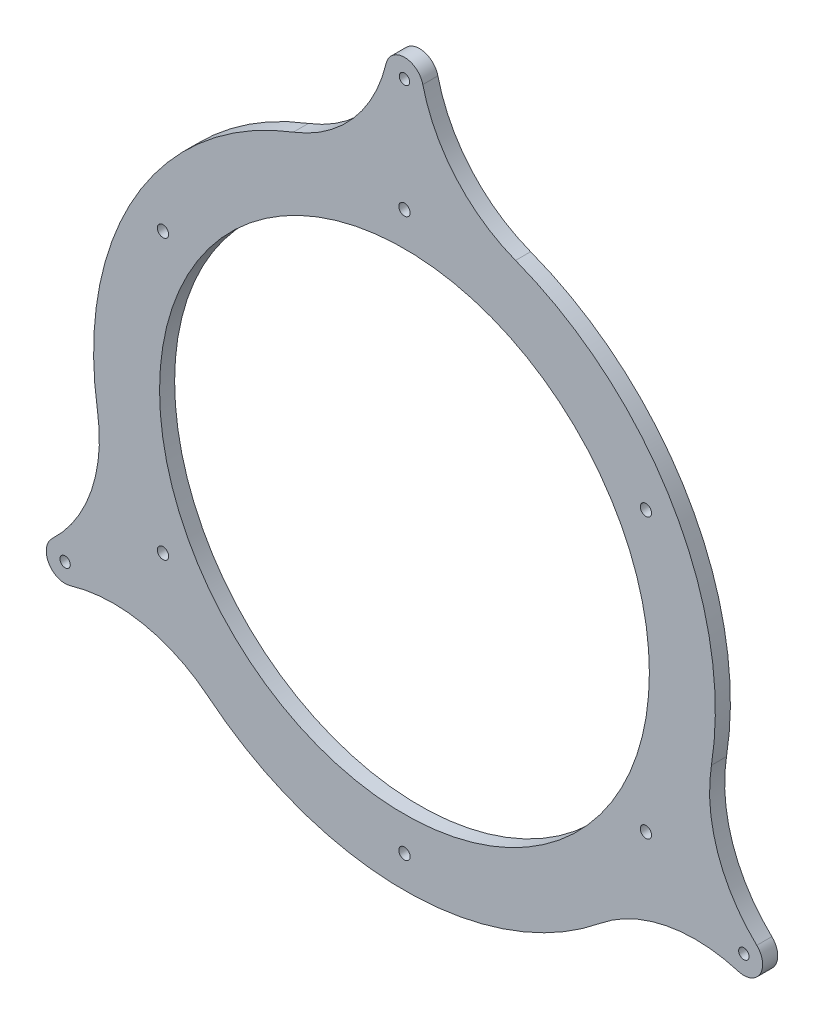
ISO-10303-21;
HEADER;
FILE_DESCRIPTION(('STEP AP214'),'2;1');
FILE_NAME('part.step','',(''),(''),'','','');
FILE_SCHEMA(('AUTOMOTIVE_DESIGN { 1 0 10303 214 1 1 1 1 }'));
ENDSEC;
DATA;
#1=APPLICATION_CONTEXT('core data for automotive mechanical design processes');
#2=APPLICATION_PROTOCOL_DEFINITION('international standard','automotive_design',2000,#1);
#3=PRODUCT_CONTEXT('',#1,'mechanical');
#4=PRODUCT('Part','Part','',(#3));
#5=PRODUCT_RELATED_PRODUCT_CATEGORY('part','',(#4));
#6=PRODUCT_DEFINITION_FORMATION('','',#4);
#7=PRODUCT_DEFINITION_CONTEXT('part definition',#1,'design');
#8=PRODUCT_DEFINITION('design','',#6,#7);
#9=PRODUCT_DEFINITION_SHAPE('','',#8);
#10=(LENGTH_UNIT() NAMED_UNIT(*) SI_UNIT(.MILLI.,.METRE.));
#11=(NAMED_UNIT(*) PLANE_ANGLE_UNIT() SI_UNIT($,.RADIAN.));
#12=(NAMED_UNIT(*) SI_UNIT($,.STERADIAN.) SOLID_ANGLE_UNIT());
#13=UNCERTAINTY_MEASURE_WITH_UNIT(LENGTH_MEASURE(1.E-05),#10,'distance_accuracy_value','');
#14=(GEOMETRIC_REPRESENTATION_CONTEXT(3) GLOBAL_UNCERTAINTY_ASSIGNED_CONTEXT((#13)) GLOBAL_UNIT_ASSIGNED_CONTEXT((#10,
#11,#12)) REPRESENTATION_CONTEXT('',''));
#15=CARTESIAN_POINT('',(0.,0.,0.));
#16=DIRECTION('',(0.,0.,1.));
#17=DIRECTION('',(1.,0.,0.));
#18=AXIS2_PLACEMENT_3D('',#15,#16,#17);
#19=CARTESIAN_POINT('',(21.8896945094251,57.2049278846154,4.));
#20=DIRECTION('',(0.,0.,1.));
#21=DIRECTION('',(1.,0.,0.));
#22=AXIS2_PLACEMENT_3D('',#19,#20,#21);
#23=PLANE('',#22);
#24=CARTESIAN_POINT('',(64.0858798800485,37.,4.));
#25=DIRECTION('',(0.,0.,1.));
#26=DIRECTION('',(1.,0.,0.));
#27=AXIS2_PLACEMENT_3D('',#24,#25,#26);
#28=CIRCLE('',#27,1.5);
#29=CARTESIAN_POINT('',(65.5858798800485,37.,4.));
#30=VERTEX_POINT('',#29);
#31=EDGE_CURVE('E313',#30,#30,#28,.T.);
#32=ORIENTED_EDGE('',*,*,#31,.F.);
#33=EDGE_LOOP('',(#32));
#34=FACE_BOUND('',#33,.T.);
#35=CARTESIAN_POINT('',(0.,-74.,4.));
#36=DIRECTION('',(0.,0.,1.));
#37=DIRECTION('',(1.,0.,0.));
#38=AXIS2_PLACEMENT_3D('',#35,#36,#37);
#39=CIRCLE('',#38,1.5);
#40=CARTESIAN_POINT('',(1.5,-74.,4.));
#41=VERTEX_POINT('',#40);
#42=EDGE_CURVE('E310',#41,#41,#39,.T.);
#43=ORIENTED_EDGE('',*,*,#42,.F.);
#44=EDGE_LOOP('',(#43));
#45=FACE_BOUND('',#44,.T.);
#46=CARTESIAN_POINT('',(0.,0.,4.));
#47=DIRECTION('',(0.,0.,1.));
#48=DIRECTION('',(1.,0.,0.));
#49=AXIS2_PLACEMENT_3D('',#46,#47,#48);
#50=CIRCLE('',#49,65.);
#51=CARTESIAN_POINT('',(65.,0.,4.));
#52=VERTEX_POINT('',#51);
#53=EDGE_CURVE('E316',#52,#52,#50,.T.);
#54=ORIENTED_EDGE('',*,*,#53,.F.);
#55=EDGE_LOOP('',(#54));
#56=FACE_BOUND('',#55,.T.);
#57=CARTESIAN_POINT('',(-64.0858798800484,-37.,4.));
#58=DIRECTION('',(0.,0.,1.));
#59=DIRECTION('',(1.,0.,0.));
#60=AXIS2_PLACEMENT_3D('',#57,#58,#59);
#61=CIRCLE('',#60,1.5);
#62=CARTESIAN_POINT('',(-62.5858798800484,-37.,4.));
#63=VERTEX_POINT('',#62);
#64=EDGE_CURVE('E330',#63,#63,#61,.T.);
#65=ORIENTED_EDGE('',*,*,#64,.F.);
#66=EDGE_LOOP('',(#65));
#67=FACE_BOUND('',#66,.T.);
#68=CARTESIAN_POINT('',(64.0858798800485,-37.,4.));
#69=DIRECTION('',(0.,0.,1.));
#70=DIRECTION('',(1.,0.,0.));
#71=AXIS2_PLACEMENT_3D('',#68,#69,#70);
#72=CIRCLE('',#71,1.5);
#73=CARTESIAN_POINT('',(65.5858798800485,-37.,4.));
#74=VERTEX_POINT('',#73);
#75=EDGE_CURVE('E331',#74,#74,#72,.T.);
#76=ORIENTED_EDGE('',*,*,#75,.F.);
#77=EDGE_LOOP('',(#76));
#78=FACE_BOUND('',#77,.T.);
#79=CARTESIAN_POINT('',(-64.0858798800484,37.,4.));
#80=DIRECTION('',(0.,0.,1.));
#81=DIRECTION('',(1.,0.,0.));
#82=AXIS2_PLACEMENT_3D('',#79,#80,#81);
#83=CIRCLE('',#82,1.5);
#84=CARTESIAN_POINT('',(-62.5858798800484,37.,4.));
#85=VERTEX_POINT('',#84);
#86=EDGE_CURVE('E324',#85,#85,#83,.T.);
#87=ORIENTED_EDGE('',*,*,#86,.F.);
#88=EDGE_LOOP('',(#87));
#89=FACE_BOUND('',#88,.T.);
#90=CARTESIAN_POINT('',(0.,74.,4.));
#91=DIRECTION('',(0.,0.,1.));
#92=DIRECTION('',(1.,0.,0.));
#93=AXIS2_PLACEMENT_3D('',#90,#91,#92);
#94=CIRCLE('',#93,1.5);
#95=CARTESIAN_POINT('',(1.5,74.,4.));
#96=VERTEX_POINT('',#95);
#97=EDGE_CURVE('E342',#96,#96,#94,.T.);
#98=ORIENTED_EDGE('',*,*,#97,.F.);
#99=EDGE_LOOP('',(#98));
#100=FACE_BOUND('',#99,.T.);
#101=CARTESIAN_POINT('',(90.0666419935817,-52.,4.));
#102=DIRECTION('',(0.,0.,1.));
#103=DIRECTION('',(1.,0.,0.));
#104=AXIS2_PLACEMENT_3D('',#101,#102,#103);
#105=CIRCLE('',#104,1.375);
#106=CARTESIAN_POINT('',(91.4416419935817,-52.,4.));
#107=VERTEX_POINT('',#106);
#108=EDGE_CURVE('E357',#107,#107,#105,.T.);
#109=ORIENTED_EDGE('',*,*,#108,.F.);
#110=EDGE_LOOP('',(#109));
#111=FACE_BOUND('',#110,.T.);
#112=CARTESIAN_POINT('',(43.7793890188501,114.409855769231,4.));
#113=DIRECTION('',(0.,0.,-1.));
#114=DIRECTION('',(1.,0.,0.));
#115=AXIS2_PLACEMENT_3D('',#112,#113,#114);
#116=CIRCLE('',#115,40.);
#117=CARTESIAN_POINT('',(29.4840783188174,77.0515355180534,4.));
#118=VERTEX_POINT('',#117);
#119=CARTESIAN_POINT('',(4.86437655765001,105.156650641026,4.));
#120=VERTEX_POINT('',#119);
#121=EDGE_CURVE('E177',#118,#120,#116,.T.);
#122=ORIENTED_EDGE('',*,*,#121,.T.);
#123=CARTESIAN_POINT('',(0.,104.,4.));
#124=DIRECTION('',(0.,0.,1.));
#125=DIRECTION('',(1.,0.,0.));
#126=AXIS2_PLACEMENT_3D('',#123,#124,#125);
#127=CIRCLE('',#126,5.);
#128=CARTESIAN_POINT('',(-4.86437655765001,105.156650641026,4.));
#129=VERTEX_POINT('',#128);
#130=EDGE_CURVE('E105',#120,#129,#127,.T.);
#131=ORIENTED_EDGE('',*,*,#130,.T.);
#132=CARTESIAN_POINT('',(-43.7793890188501,114.409855769231,4.));
#133=DIRECTION('',(0.,0.,-1.));
#134=DIRECTION('',(-1.,0.,0.));
#135=AXIS2_PLACEMENT_3D('',#132,#133,#134);
#136=CIRCLE('',#135,40.);
#137=CARTESIAN_POINT('',(-29.4840783188174,77.0515355180534,4.));
#138=VERTEX_POINT('',#137);
#139=EDGE_CURVE('E204',#129,#138,#136,.T.);
#140=ORIENTED_EDGE('',*,*,#139,.T.);
#141=CARTESIAN_POINT('',(0.,0.,4.));
#142=DIRECTION('',(0.,0.,1.));
#143=DIRECTION('',(1.,0.,0.));
#144=AXIS2_PLACEMENT_3D('',#141,#142,#143);
#145=CIRCLE('',#144,82.5);
#146=CARTESIAN_POINT('',(-81.4706263186419,-12.9918069277609,4.));
#147=VERTEX_POINT('',#146);
#148=EDGE_CURVE('E223',#138,#147,#145,.T.);
#149=ORIENTED_EDGE('',*,*,#148,.T.);
#150=CARTESIAN_POINT('',(-120.971536048893,-19.2908648321298,4.));
#151=DIRECTION('',(0.,0.,-1.));
#152=DIRECTION('',(1.,0.,0.));
#153=AXIS2_PLACEMENT_3D('',#150,#151,#152);
#154=CIRCLE('',#153,40.);
#155=CARTESIAN_POINT('',(-93.5005191108384,-48.3656516480145,4.));
#156=VERTEX_POINT('',#155);
#157=EDGE_CURVE('E220',#147,#156,#154,.T.);
#158=ORIENTED_EDGE('',*,*,#157,.T.);
#159=CARTESIAN_POINT('',(-90.0666419935816,-52.,4.));
#160=DIRECTION('',(0.,0.,1.));
#161=DIRECTION('',(1.,0.,0.));
#162=AXIS2_PLACEMENT_3D('',#159,#160,#161);
#163=CIRCLE('',#162,5.);
#164=CARTESIAN_POINT('',(-88.6361425531883,-56.7909989930113,4.));
#165=VERTEX_POINT('',#164);
#166=EDGE_CURVE('E222',#156,#165,#163,.T.);
#167=ORIENTED_EDGE('',*,*,#166,.T.);
#168=CARTESIAN_POINT('',(-77.1921470300424,-95.1189909371011,4.));
#169=DIRECTION('',(0.,0.,-1.));
#170=DIRECTION('',(-1.,0.,0.));
#171=AXIS2_PLACEMENT_3D('',#168,#169,#170);
#172=CIRCLE('',#171,40.);
#173=CARTESIAN_POINT('',(-51.9865479998245,-64.0597285902926,4.));
#174=VERTEX_POINT('',#173);
#175=EDGE_CURVE('E225',#165,#174,#172,.T.);
#176=ORIENTED_EDGE('',*,*,#175,.T.);
#177=CARTESIAN_POINT('',(0.,0.,4.));
#178=DIRECTION('',(0.,0.,1.));
#179=DIRECTION('',(1.,0.,0.));
#180=AXIS2_PLACEMENT_3D('',#177,#178,#179);
#181=CIRCLE('',#180,82.5);
#182=CARTESIAN_POINT('',(51.9865479998245,-64.0597285902926,4.));
#183=VERTEX_POINT('',#182);
#184=EDGE_CURVE('E231',#174,#183,#181,.T.);
#185=ORIENTED_EDGE('',*,*,#184,.T.);
#186=CARTESIAN_POINT('',(77.1921470300425,-95.118990937101,4.));
#187=DIRECTION('',(0.,0.,-1.));
#188=DIRECTION('',(1.,0.,0.));
#189=AXIS2_PLACEMENT_3D('',#186,#187,#188);
#190=CIRCLE('',#189,40.);
#191=CARTESIAN_POINT('',(88.6361425531884,-56.7909989930112,4.));
#192=VERTEX_POINT('',#191);
#193=EDGE_CURVE('E136',#183,#192,#190,.T.);
#194=ORIENTED_EDGE('',*,*,#193,.T.);
#195=CARTESIAN_POINT('',(90.0666419935817,-52.,4.));
#196=DIRECTION('',(0.,0.,1.));
#197=DIRECTION('',(1.,0.,0.));
#198=AXIS2_PLACEMENT_3D('',#195,#196,#197);
#199=CIRCLE('',#198,5.);
#200=CARTESIAN_POINT('',(93.5005191108384,-48.3656516480144,4.));
#201=VERTEX_POINT('',#200);
#202=EDGE_CURVE('E130',#192,#201,#199,.T.);
#203=ORIENTED_EDGE('',*,*,#202,.T.);
#204=CARTESIAN_POINT('',(120.971536048893,-19.2908648321297,4.));
#205=DIRECTION('',(0.,0.,-1.));
#206=DIRECTION('',(-1.,0.,0.));
#207=AXIS2_PLACEMENT_3D('',#204,#205,#206);
#208=CIRCLE('',#207,40.);
#209=CARTESIAN_POINT('',(81.4706263186419,-12.9918069277608,4.));
#210=VERTEX_POINT('',#209);
#211=EDGE_CURVE('E134',#201,#210,#208,.T.);
#212=ORIENTED_EDGE('',*,*,#211,.T.);
#213=CARTESIAN_POINT('',(0.,0.,4.));
#214=DIRECTION('',(0.,0.,1.));
#215=DIRECTION('',(1.,0.,0.));
#216=AXIS2_PLACEMENT_3D('',#213,#214,#215);
#217=CIRCLE('',#216,82.5);
#218=EDGE_CURVE('E50',#210,#118,#217,.T.);
#219=ORIENTED_EDGE('',*,*,#218,.T.);
#220=EDGE_LOOP('',(#122,#131,#140,#149,#158,#167,#176,#185,#194,#203,#212,#219));
#221=FACE_BOUND('',#220,.T.);
#222=CARTESIAN_POINT('',(0.,104.,4.));
#223=DIRECTION('',(0.,0.,1.));
#224=DIRECTION('',(1.,0.,0.));
#225=AXIS2_PLACEMENT_3D('',#222,#223,#224);
#226=CIRCLE('',#225,1.375);
#227=CARTESIAN_POINT('',(1.375,104.,4.));
#228=VERTEX_POINT('',#227);
#229=EDGE_CURVE('E158',#228,#228,#226,.T.);
#230=ORIENTED_EDGE('',*,*,#229,.F.);
#231=EDGE_LOOP('',(#230));
#232=FACE_BOUND('',#231,.T.);
#233=CARTESIAN_POINT('',(-90.0666419935816,-52.,4.));
#234=DIRECTION('',(0.,0.,1.));
#235=DIRECTION('',(1.,0.,0.));
#236=AXIS2_PLACEMENT_3D('',#233,#234,#235);
#237=CIRCLE('',#236,1.375);
#238=CARTESIAN_POINT('',(-88.6916419935816,-52.,4.));
#239=VERTEX_POINT('',#238);
#240=EDGE_CURVE('E351',#239,#239,#237,.T.);
#241=ORIENTED_EDGE('',*,*,#240,.F.);
#242=EDGE_LOOP('',(#241));
#243=FACE_BOUND('',#242,.T.);
#244=ADVANCED_FACE('F33',(#34,#45,#56,#67,#78,#89,#100,#111,#221,#232,#243),#23,.T.);
#245=CARTESIAN_POINT('',(21.8896945094251,57.2049278846154,0.));
#246=DIRECTION('',(0.,0.,1.));
#247=DIRECTION('',(1.,0.,0.));
#248=AXIS2_PLACEMENT_3D('',#245,#246,#247);
#249=PLANE('',#248);
#250=CARTESIAN_POINT('',(64.0858798800485,37.,0.));
#251=DIRECTION('',(0.,0.,1.));
#252=DIRECTION('',(1.,0.,0.));
#253=AXIS2_PLACEMENT_3D('',#250,#251,#252);
#254=CIRCLE('',#253,1.5);
#255=CARTESIAN_POINT('',(65.5858798800485,37.,0.));
#256=VERTEX_POINT('',#255);
#257=EDGE_CURVE('E321',#256,#256,#254,.T.);
#258=ORIENTED_EDGE('',*,*,#257,.T.);
#259=EDGE_LOOP('',(#258));
#260=FACE_BOUND('',#259,.T.);
#261=CARTESIAN_POINT('',(0.,-74.,0.));
#262=DIRECTION('',(0.,0.,1.));
#263=DIRECTION('',(1.,0.,0.));
#264=AXIS2_PLACEMENT_3D('',#261,#262,#263);
#265=CIRCLE('',#264,1.5);
#266=CARTESIAN_POINT('',(1.5,-74.,0.));
#267=VERTEX_POINT('',#266);
#268=EDGE_CURVE('E307',#267,#267,#265,.T.);
#269=ORIENTED_EDGE('',*,*,#268,.T.);
#270=EDGE_LOOP('',(#269));
#271=FACE_BOUND('',#270,.T.);
#272=CARTESIAN_POINT('',(0.,0.,0.));
#273=DIRECTION('',(0.,0.,1.));
#274=DIRECTION('',(1.,0.,0.));
#275=AXIS2_PLACEMENT_3D('',#272,#273,#274);
#276=CIRCLE('',#275,65.);
#277=CARTESIAN_POINT('',(65.,0.,0.));
#278=VERTEX_POINT('',#277);
#279=EDGE_CURVE('E311',#278,#278,#276,.T.);
#280=ORIENTED_EDGE('',*,*,#279,.T.);
#281=EDGE_LOOP('',(#280));
#282=FACE_BOUND('',#281,.T.);
#283=CARTESIAN_POINT('',(-64.0858798800484,-37.,0.));
#284=DIRECTION('',(0.,0.,1.));
#285=DIRECTION('',(1.,0.,0.));
#286=AXIS2_PLACEMENT_3D('',#283,#284,#285);
#287=CIRCLE('',#286,1.5);
#288=CARTESIAN_POINT('',(-62.5858798800484,-37.,0.));
#289=VERTEX_POINT('',#288);
#290=EDGE_CURVE('E339',#289,#289,#287,.T.);
#291=ORIENTED_EDGE('',*,*,#290,.T.);
#292=EDGE_LOOP('',(#291));
#293=FACE_BOUND('',#292,.T.);
#294=CARTESIAN_POINT('',(64.0858798800485,-37.,0.));
#295=DIRECTION('',(0.,0.,1.));
#296=DIRECTION('',(1.,0.,0.));
#297=AXIS2_PLACEMENT_3D('',#294,#295,#296);
#298=CIRCLE('',#297,1.5);
#299=CARTESIAN_POINT('',(65.5858798800485,-37.,0.));
#300=VERTEX_POINT('',#299);
#301=EDGE_CURVE('E327',#300,#300,#298,.T.);
#302=ORIENTED_EDGE('',*,*,#301,.T.);
#303=EDGE_LOOP('',(#302));
#304=FACE_BOUND('',#303,.T.);
#305=CARTESIAN_POINT('',(-64.0858798800484,37.,0.));
#306=DIRECTION('',(0.,0.,1.));
#307=DIRECTION('',(1.,0.,0.));
#308=AXIS2_PLACEMENT_3D('',#305,#306,#307);
#309=CIRCLE('',#308,1.5);
#310=CARTESIAN_POINT('',(-62.5858798800484,37.,0.));
#311=VERTEX_POINT('',#310);
#312=EDGE_CURVE('E334',#311,#311,#309,.T.);
#313=ORIENTED_EDGE('',*,*,#312,.T.);
#314=EDGE_LOOP('',(#313));
#315=FACE_BOUND('',#314,.T.);
#316=CARTESIAN_POINT('',(0.,74.,0.));
#317=DIRECTION('',(0.,0.,1.));
#318=DIRECTION('',(1.,0.,0.));
#319=AXIS2_PLACEMENT_3D('',#316,#317,#318);
#320=CIRCLE('',#319,1.5);
#321=CARTESIAN_POINT('',(1.5,74.,0.));
#322=VERTEX_POINT('',#321);
#323=EDGE_CURVE('E345',#322,#322,#320,.T.);
#324=ORIENTED_EDGE('',*,*,#323,.T.);
#325=EDGE_LOOP('',(#324));
#326=FACE_BOUND('',#325,.T.);
#327=CARTESIAN_POINT('',(43.7793890188501,114.409855769231,0.));
#328=DIRECTION('',(0.,0.,-1.));
#329=DIRECTION('',(1.,0.,0.));
#330=AXIS2_PLACEMENT_3D('',#327,#328,#329);
#331=CIRCLE('',#330,40.);
#332=CARTESIAN_POINT('',(29.4840783188174,77.0515355180534,0.));
#333=VERTEX_POINT('',#332);
#334=CARTESIAN_POINT('',(4.86437655765001,105.156650641026,0.));
#335=VERTEX_POINT('',#334);
#336=EDGE_CURVE('E154',#333,#335,#331,.T.);
#337=ORIENTED_EDGE('',*,*,#336,.F.);
#338=CARTESIAN_POINT('',(0.,0.,0.));
#339=DIRECTION('',(0.,0.,1.));
#340=DIRECTION('',(1.,0.,0.));
#341=AXIS2_PLACEMENT_3D('',#338,#339,#340);
#342=CIRCLE('',#341,82.5);
#343=CARTESIAN_POINT('',(81.4706263186419,-12.9918069277608,0.));
#344=VERTEX_POINT('',#343);
#345=EDGE_CURVE('E97',#344,#333,#342,.T.);
#346=ORIENTED_EDGE('',*,*,#345,.F.);
#347=CARTESIAN_POINT('',(120.971536048893,-19.2908648321297,0.));
#348=DIRECTION('',(0.,0.,-1.));
#349=DIRECTION('',(-1.,0.,0.));
#350=AXIS2_PLACEMENT_3D('',#347,#348,#349);
#351=CIRCLE('',#350,40.);
#352=CARTESIAN_POINT('',(93.5005191108384,-48.3656516480144,0.));
#353=VERTEX_POINT('',#352);
#354=EDGE_CURVE('E91',#353,#344,#351,.T.);
#355=ORIENTED_EDGE('',*,*,#354,.F.);
#356=CARTESIAN_POINT('',(90.0666419935817,-52.,0.));
#357=DIRECTION('',(0.,0.,1.));
#358=DIRECTION('',(1.,0.,0.));
#359=AXIS2_PLACEMENT_3D('',#356,#357,#358);
#360=CIRCLE('',#359,5.);
#361=CARTESIAN_POINT('',(88.6361425531884,-56.7909989930112,0.));
#362=VERTEX_POINT('',#361);
#363=EDGE_CURVE('E144',#362,#353,#360,.T.);
#364=ORIENTED_EDGE('',*,*,#363,.F.);
#365=CARTESIAN_POINT('',(77.1921470300425,-95.118990937101,0.));
#366=DIRECTION('',(0.,0.,-1.));
#367=DIRECTION('',(1.,0.,0.));
#368=AXIS2_PLACEMENT_3D('',#365,#366,#367);
#369=CIRCLE('',#368,40.);
#370=CARTESIAN_POINT('',(51.9865479998245,-64.0597285902926,0.));
#371=VERTEX_POINT('',#370);
#372=EDGE_CURVE('E172',#371,#362,#369,.T.);
#373=ORIENTED_EDGE('',*,*,#372,.F.);
#374=CARTESIAN_POINT('',(0.,0.,0.));
#375=DIRECTION('',(0.,0.,1.));
#376=DIRECTION('',(1.,0.,0.));
#377=AXIS2_PLACEMENT_3D('',#374,#375,#376);
#378=CIRCLE('',#377,82.5);
#379=CARTESIAN_POINT('',(-51.9865479998245,-64.0597285902926,0.));
#380=VERTEX_POINT('',#379);
#381=EDGE_CURVE('E170',#380,#371,#378,.T.);
#382=ORIENTED_EDGE('',*,*,#381,.F.);
#383=CARTESIAN_POINT('',(-77.1921470300424,-95.1189909371011,0.));
#384=DIRECTION('',(0.,0.,-1.));
#385=DIRECTION('',(-1.,0.,0.));
#386=AXIS2_PLACEMENT_3D('',#383,#384,#385);
#387=CIRCLE('',#386,40.);
#388=CARTESIAN_POINT('',(-88.6361425531883,-56.7909989930113,0.));
#389=VERTEX_POINT('',#388);
#390=EDGE_CURVE('E168',#389,#380,#387,.T.);
#391=ORIENTED_EDGE('',*,*,#390,.F.);
#392=CARTESIAN_POINT('',(-90.0666419935816,-52.,0.));
#393=DIRECTION('',(0.,0.,1.));
#394=DIRECTION('',(1.,0.,0.));
#395=AXIS2_PLACEMENT_3D('',#392,#393,#394);
#396=CIRCLE('',#395,5.);
#397=CARTESIAN_POINT('',(-93.5005191108384,-48.3656516480145,0.));
#398=VERTEX_POINT('',#397);
#399=EDGE_CURVE('E166',#398,#389,#396,.T.);
#400=ORIENTED_EDGE('',*,*,#399,.F.);
#401=CARTESIAN_POINT('',(-120.971536048893,-19.2908648321298,0.));
#402=DIRECTION('',(0.,0.,-1.));
#403=DIRECTION('',(1.,0.,0.));
#404=AXIS2_PLACEMENT_3D('',#401,#402,#403);
#405=CIRCLE('',#404,40.);
#406=CARTESIAN_POINT('',(-81.4706263186419,-12.9918069277609,0.));
#407=VERTEX_POINT('',#406);
#408=EDGE_CURVE('E164',#407,#398,#405,.T.);
#409=ORIENTED_EDGE('',*,*,#408,.F.);
#410=CARTESIAN_POINT('',(0.,0.,0.));
#411=DIRECTION('',(0.,0.,1.));
#412=DIRECTION('',(1.,0.,0.));
#413=AXIS2_PLACEMENT_3D('',#410,#411,#412);
#414=CIRCLE('',#413,82.5);
#415=CARTESIAN_POINT('',(-29.4840783188174,77.0515355180534,0.));
#416=VERTEX_POINT('',#415);
#417=EDGE_CURVE('E162',#416,#407,#414,.T.);
#418=ORIENTED_EDGE('',*,*,#417,.F.);
#419=CARTESIAN_POINT('',(-43.7793890188501,114.409855769231,0.));
#420=DIRECTION('',(0.,0.,-1.));
#421=DIRECTION('',(-1.,0.,0.));
#422=AXIS2_PLACEMENT_3D('',#419,#420,#421);
#423=CIRCLE('',#422,40.);
#424=CARTESIAN_POINT('',(-4.86437655765001,105.156650641026,0.));
#425=VERTEX_POINT('',#424);
#426=EDGE_CURVE('E160',#425,#416,#423,.T.);
#427=ORIENTED_EDGE('',*,*,#426,.F.);
#428=CARTESIAN_POINT('',(0.,104.,0.));
#429=DIRECTION('',(0.,0.,1.));
#430=DIRECTION('',(1.,0.,0.));
#431=AXIS2_PLACEMENT_3D('',#428,#429,#430);
#432=CIRCLE('',#431,5.);
#433=EDGE_CURVE('E157',#335,#425,#432,.T.);
#434=ORIENTED_EDGE('',*,*,#433,.F.);
#435=EDGE_LOOP('',(#337,#346,#355,#364,#373,#382,#391,#400,#409,#418,#427,#434));
#436=FACE_BOUND('',#435,.T.);
#437=CARTESIAN_POINT('',(0.,104.,0.));
#438=DIRECTION('',(0.,0.,1.));
#439=DIRECTION('',(1.,0.,0.));
#440=AXIS2_PLACEMENT_3D('',#437,#438,#439);
#441=CIRCLE('',#440,1.375);
#442=CARTESIAN_POINT('',(1.375,104.,0.));
#443=VERTEX_POINT('',#442);
#444=EDGE_CURVE('E360',#443,#443,#441,.T.);
#445=ORIENTED_EDGE('',*,*,#444,.T.);
#446=EDGE_LOOP('',(#445));
#447=FACE_BOUND('',#446,.T.);
#448=CARTESIAN_POINT('',(90.0666419935817,-52.,0.));
#449=DIRECTION('',(0.,0.,1.));
#450=DIRECTION('',(1.,0.,0.));
#451=AXIS2_PLACEMENT_3D('',#448,#449,#450);
#452=CIRCLE('',#451,1.375);
#453=CARTESIAN_POINT('',(91.4416419935817,-52.,0.));
#454=VERTEX_POINT('',#453);
#455=EDGE_CURVE('E354',#454,#454,#452,.T.);
#456=ORIENTED_EDGE('',*,*,#455,.T.);
#457=EDGE_LOOP('',(#456));
#458=FACE_BOUND('',#457,.T.);
#459=CARTESIAN_POINT('',(-90.0666419935816,-52.,0.));
#460=DIRECTION('',(0.,0.,1.));
#461=DIRECTION('',(1.,0.,0.));
#462=AXIS2_PLACEMENT_3D('',#459,#460,#461);
#463=CIRCLE('',#462,1.375);
#464=CARTESIAN_POINT('',(-88.6916419935816,-52.,0.));
#465=VERTEX_POINT('',#464);
#466=EDGE_CURVE('E348',#465,#465,#463,.T.);
#467=ORIENTED_EDGE('',*,*,#466,.T.);
#468=EDGE_LOOP('',(#467));
#469=FACE_BOUND('',#468,.T.);
#470=ADVANCED_FACE('F208',(#260,#271,#282,#293,#304,#315,#326,#436,#447,#458,#469),#249,.F.);
#471=CARTESIAN_POINT('',(43.7793890188501,114.409855769231,4.));
#472=DIRECTION('',(0.,0.,-1.));
#473=DIRECTION('',(-1.,0.,0.));
#474=AXIS2_PLACEMENT_3D('',#471,#472,#473);
#475=CYLINDRICAL_SURFACE('',#474,40.);
#476=ORIENTED_EDGE('',*,*,#336,.T.);
#477=DIRECTION('',(0.,0.,-1.));
#478=VECTOR('',#477,1.);
#479=CARTESIAN_POINT('',(4.86437655765001,105.156650641026,4.));
#480=LINE('',#479,#478);
#481=EDGE_CURVE('E11',#120,#335,#480,.T.);
#482=ORIENTED_EDGE('',*,*,#481,.F.);
#483=ORIENTED_EDGE('',*,*,#121,.F.);
#484=DIRECTION('',(0.,0.,-1.));
#485=VECTOR('',#484,1.);
#486=CARTESIAN_POINT('',(29.4840783188174,77.0515355180534,4.));
#487=LINE('',#486,#485);
#488=EDGE_CURVE('E150',#118,#333,#487,.T.);
#489=ORIENTED_EDGE('',*,*,#488,.T.);
#490=EDGE_LOOP('',(#476,#482,#483,#489));
#491=FACE_BOUND('',#490,.T.);
#492=ADVANCED_FACE('F35',(#491),#475,.F.);
#493=CARTESIAN_POINT('',(0.,104.,4.));
#494=DIRECTION('',(0.,0.,-1.));
#495=DIRECTION('',(-1.,0.,0.));
#496=AXIS2_PLACEMENT_3D('',#493,#494,#495);
#497=CYLINDRICAL_SURFACE('',#496,5.);
#498=ORIENTED_EDGE('',*,*,#433,.T.);
#499=DIRECTION('',(0.,0.,-1.));
#500=VECTOR('',#499,1.);
#501=CARTESIAN_POINT('',(-4.86437655765001,105.156650641026,4.));
#502=LINE('',#501,#500);
#503=EDGE_CURVE('E42',#129,#425,#502,.T.);
#504=ORIENTED_EDGE('',*,*,#503,.F.);
#505=ORIENTED_EDGE('',*,*,#130,.F.);
#506=ORIENTED_EDGE('',*,*,#481,.T.);
#507=EDGE_LOOP('',(#498,#504,#505,#506));
#508=FACE_BOUND('',#507,.T.);
#509=ADVANCED_FACE('F529',(#508),#497,.T.);
#510=CARTESIAN_POINT('',(-43.7793890188501,114.409855769231,4.));
#511=DIRECTION('',(0.,0.,-1.));
#512=DIRECTION('',(-1.,0.,0.));
#513=AXIS2_PLACEMENT_3D('',#510,#511,#512);
#514=CYLINDRICAL_SURFACE('',#513,40.);
#515=ORIENTED_EDGE('',*,*,#426,.T.);
#516=DIRECTION('',(0.,0.,-1.));
#517=VECTOR('',#516,1.);
#518=CARTESIAN_POINT('',(-29.4840783188174,77.0515355180534,4.));
#519=LINE('',#518,#517);
#520=EDGE_CURVE('E196',#138,#416,#519,.T.);
#521=ORIENTED_EDGE('',*,*,#520,.F.);
#522=ORIENTED_EDGE('',*,*,#139,.F.);
#523=ORIENTED_EDGE('',*,*,#503,.T.);
#524=EDGE_LOOP('',(#515,#521,#522,#523));
#525=FACE_BOUND('',#524,.T.);
#526=ADVANCED_FACE('F202',(#525),#514,.F.);
#527=CARTESIAN_POINT('',(0.,0.,4.));
#528=DIRECTION('',(0.,0.,-1.));
#529=DIRECTION('',(-1.,0.,0.));
#530=AXIS2_PLACEMENT_3D('',#527,#528,#529);
#531=CYLINDRICAL_SURFACE('',#530,82.5);
#532=ORIENTED_EDGE('',*,*,#417,.T.);
#533=DIRECTION('',(0.,0.,-1.));
#534=VECTOR('',#533,1.);
#535=CARTESIAN_POINT('',(-81.4706263186419,-12.9918069277609,4.));
#536=LINE('',#535,#534);
#537=EDGE_CURVE('E193',#147,#407,#536,.T.);
#538=ORIENTED_EDGE('',*,*,#537,.F.);
#539=ORIENTED_EDGE('',*,*,#148,.F.);
#540=ORIENTED_EDGE('',*,*,#520,.T.);
#541=EDGE_LOOP('',(#532,#538,#539,#540));
#542=FACE_BOUND('',#541,.T.);
#543=ADVANCED_FACE('F214',(#542),#531,.T.);
#544=CARTESIAN_POINT('',(-120.971536048893,-19.2908648321298,4.));
#545=DIRECTION('',(0.,0.,-1.));
#546=DIRECTION('',(-1.,0.,0.));
#547=AXIS2_PLACEMENT_3D('',#544,#545,#546);
#548=CYLINDRICAL_SURFACE('',#547,40.);
#549=ORIENTED_EDGE('',*,*,#408,.T.);
#550=DIRECTION('',(0.,0.,-1.));
#551=VECTOR('',#550,1.);
#552=CARTESIAN_POINT('',(-93.5005191108384,-48.3656516480145,4.));
#553=LINE('',#552,#551);
#554=EDGE_CURVE('E190',#156,#398,#553,.T.);
#555=ORIENTED_EDGE('',*,*,#554,.F.);
#556=ORIENTED_EDGE('',*,*,#157,.F.);
#557=ORIENTED_EDGE('',*,*,#537,.T.);
#558=EDGE_LOOP('',(#549,#555,#556,#557));
#559=FACE_BOUND('',#558,.T.);
#560=ADVANCED_FACE('F218',(#559),#548,.F.);
#561=CARTESIAN_POINT('',(-90.0666419935816,-52.,4.));
#562=DIRECTION('',(0.,0.,-1.));
#563=DIRECTION('',(-1.,0.,0.));
#564=AXIS2_PLACEMENT_3D('',#561,#562,#563);
#565=CYLINDRICAL_SURFACE('',#564,5.);
#566=ORIENTED_EDGE('',*,*,#399,.T.);
#567=DIRECTION('',(0.,0.,-1.));
#568=VECTOR('',#567,1.);
#569=CARTESIAN_POINT('',(-88.6361425531883,-56.7909989930113,4.));
#570=LINE('',#569,#568);
#571=EDGE_CURVE('E187',#165,#389,#570,.T.);
#572=ORIENTED_EDGE('',*,*,#571,.F.);
#573=ORIENTED_EDGE('',*,*,#166,.F.);
#574=ORIENTED_EDGE('',*,*,#554,.T.);
#575=EDGE_LOOP('',(#566,#572,#573,#574));
#576=FACE_BOUND('',#575,.T.);
#577=ADVANCED_FACE('F498',(#576),#565,.T.);
#578=CARTESIAN_POINT('',(-77.1921470300424,-95.1189909371011,4.));
#579=DIRECTION('',(0.,0.,-1.));
#580=DIRECTION('',(-1.,0.,0.));
#581=AXIS2_PLACEMENT_3D('',#578,#579,#580);
#582=CYLINDRICAL_SURFACE('',#581,40.);
#583=ORIENTED_EDGE('',*,*,#390,.T.);
#584=DIRECTION('',(0.,0.,-1.));
#585=VECTOR('',#584,1.);
#586=CARTESIAN_POINT('',(-51.9865479998245,-64.0597285902926,4.));
#587=LINE('',#586,#585);
#588=EDGE_CURVE('E184',#174,#380,#587,.T.);
#589=ORIENTED_EDGE('',*,*,#588,.F.);
#590=ORIENTED_EDGE('',*,*,#175,.F.);
#591=ORIENTED_EDGE('',*,*,#571,.T.);
#592=EDGE_LOOP('',(#583,#589,#590,#591));
#593=FACE_BOUND('',#592,.T.);
#594=ADVANCED_FACE('F490',(#593),#582,.F.);
#595=CARTESIAN_POINT('',(0.,0.,4.));
#596=DIRECTION('',(0.,0.,-1.));
#597=DIRECTION('',(-1.,0.,0.));
#598=AXIS2_PLACEMENT_3D('',#595,#596,#597);
#599=CYLINDRICAL_SURFACE('',#598,82.5);
#600=ORIENTED_EDGE('',*,*,#381,.T.);
#601=DIRECTION('',(0.,0.,-1.));
#602=VECTOR('',#601,1.);
#603=CARTESIAN_POINT('',(51.9865479998245,-64.0597285902926,4.));
#604=LINE('',#603,#602);
#605=EDGE_CURVE('E181',#183,#371,#604,.T.);
#606=ORIENTED_EDGE('',*,*,#605,.F.);
#607=ORIENTED_EDGE('',*,*,#184,.F.);
#608=ORIENTED_EDGE('',*,*,#588,.T.);
#609=EDGE_LOOP('',(#600,#606,#607,#608));
#610=FACE_BOUND('',#609,.T.);
#611=ADVANCED_FACE('F237',(#610),#599,.T.);
#612=CARTESIAN_POINT('',(77.1921470300425,-95.118990937101,4.));
#613=DIRECTION('',(0.,0.,-1.));
#614=DIRECTION('',(-1.,0.,0.));
#615=AXIS2_PLACEMENT_3D('',#612,#613,#614);
#616=CYLINDRICAL_SURFACE('',#615,40.);
#617=ORIENTED_EDGE('',*,*,#372,.T.);
#618=DIRECTION('',(0.,0.,-1.));
#619=VECTOR('',#618,1.);
#620=CARTESIAN_POINT('',(88.6361425531884,-56.7909989930112,4.));
#621=LINE('',#620,#619);
#622=EDGE_CURVE('E145',#192,#362,#621,.T.);
#623=ORIENTED_EDGE('',*,*,#622,.F.);
#624=ORIENTED_EDGE('',*,*,#193,.F.);
#625=ORIENTED_EDGE('',*,*,#605,.T.);
#626=EDGE_LOOP('',(#617,#623,#624,#625));
#627=FACE_BOUND('',#626,.T.);
#628=ADVANCED_FACE('F241',(#627),#616,.F.);
#629=CARTESIAN_POINT('',(90.0666419935817,-52.,4.));
#630=DIRECTION('',(0.,0.,-1.));
#631=DIRECTION('',(-1.,0.,0.));
#632=AXIS2_PLACEMENT_3D('',#629,#630,#631);
#633=CYLINDRICAL_SURFACE('',#632,5.);
#634=ORIENTED_EDGE('',*,*,#363,.T.);
#635=DIRECTION('',(0.,0.,-1.));
#636=VECTOR('',#635,1.);
#637=CARTESIAN_POINT('',(93.5005191108384,-48.3656516480144,4.));
#638=LINE('',#637,#636);
#639=EDGE_CURVE('E141',#201,#353,#638,.T.);
#640=ORIENTED_EDGE('',*,*,#639,.F.);
#641=ORIENTED_EDGE('',*,*,#202,.F.);
#642=ORIENTED_EDGE('',*,*,#622,.T.);
#643=EDGE_LOOP('',(#634,#640,#641,#642));
#644=FACE_BOUND('',#643,.T.);
#645=ADVANCED_FACE('F142',(#644),#633,.T.);
#646=CARTESIAN_POINT('',(120.971536048893,-19.2908648321297,4.));
#647=DIRECTION('',(0.,0.,-1.));
#648=DIRECTION('',(-1.,0.,0.));
#649=AXIS2_PLACEMENT_3D('',#646,#647,#648);
#650=CYLINDRICAL_SURFACE('',#649,40.);
#651=ORIENTED_EDGE('',*,*,#354,.T.);
#652=DIRECTION('',(0.,0.,-1.));
#653=VECTOR('',#652,1.);
#654=CARTESIAN_POINT('',(81.4706263186419,-12.9918069277608,4.));
#655=LINE('',#654,#653);
#656=EDGE_CURVE('E146',#210,#344,#655,.T.);
#657=ORIENTED_EDGE('',*,*,#656,.F.);
#658=ORIENTED_EDGE('',*,*,#211,.F.);
#659=ORIENTED_EDGE('',*,*,#639,.T.);
#660=EDGE_LOOP('',(#651,#657,#658,#659));
#661=FACE_BOUND('',#660,.T.);
#662=ADVANCED_FACE('F148',(#661),#650,.F.);
#663=CARTESIAN_POINT('',(0.,0.,4.));
#664=DIRECTION('',(0.,0.,-1.));
#665=DIRECTION('',(-1.,0.,0.));
#666=AXIS2_PLACEMENT_3D('',#663,#664,#665);
#667=CYLINDRICAL_SURFACE('',#666,82.5);
#668=ORIENTED_EDGE('',*,*,#345,.T.);
#669=ORIENTED_EDGE('',*,*,#488,.F.);
#670=ORIENTED_EDGE('',*,*,#218,.F.);
#671=ORIENTED_EDGE('',*,*,#656,.T.);
#672=EDGE_LOOP('',(#668,#669,#670,#671));
#673=FACE_BOUND('',#672,.T.);
#674=ADVANCED_FACE('F245',(#673),#667,.T.);
#675=CARTESIAN_POINT('',(0.,104.,4.));
#676=DIRECTION('',(0.,0.,-1.));
#677=DIRECTION('',(-1.,0.,0.));
#678=AXIS2_PLACEMENT_3D('',#675,#676,#677);
#679=CYLINDRICAL_SURFACE('',#678,1.375);
#680=ORIENTED_EDGE('',*,*,#229,.T.);
#681=EDGE_LOOP('',(#680));
#682=FACE_BOUND('',#681,.T.);
#683=ORIENTED_EDGE('',*,*,#444,.F.);
#684=EDGE_LOOP('',(#683));
#685=FACE_BOUND('',#684,.T.);
#686=ADVANCED_FACE('F247',(#682,#685),#679,.F.);
#687=CARTESIAN_POINT('',(90.0666419935817,-52.,4.));
#688=DIRECTION('',(0.,0.,-1.));
#689=DIRECTION('',(-1.,0.,0.));
#690=AXIS2_PLACEMENT_3D('',#687,#688,#689);
#691=CYLINDRICAL_SURFACE('',#690,1.375);
#692=ORIENTED_EDGE('',*,*,#108,.T.);
#693=EDGE_LOOP('',(#692));
#694=FACE_BOUND('',#693,.T.);
#695=ORIENTED_EDGE('',*,*,#455,.F.);
#696=EDGE_LOOP('',(#695));
#697=FACE_BOUND('',#696,.T.);
#698=ADVANCED_FACE('F253',(#694,#697),#691,.F.);
#699=CARTESIAN_POINT('',(-90.0666419935816,-52.,4.));
#700=DIRECTION('',(0.,0.,-1.));
#701=DIRECTION('',(-1.,0.,0.));
#702=AXIS2_PLACEMENT_3D('',#699,#700,#701);
#703=CYLINDRICAL_SURFACE('',#702,1.375);
#704=ORIENTED_EDGE('',*,*,#240,.T.);
#705=EDGE_LOOP('',(#704));
#706=FACE_BOUND('',#705,.T.);
#707=ORIENTED_EDGE('',*,*,#466,.F.);
#708=EDGE_LOOP('',(#707));
#709=FACE_BOUND('',#708,.T.);
#710=ADVANCED_FACE('F270',(#706,#709),#703,.F.);
#711=CARTESIAN_POINT('',(0.,74.,0.));
#712=DIRECTION('',(0.,0.,1.));
#713=DIRECTION('',(1.,0.,0.));
#714=AXIS2_PLACEMENT_3D('',#711,#712,#713);
#715=CYLINDRICAL_SURFACE('',#714,1.5);
#716=ORIENTED_EDGE('',*,*,#323,.F.);
#717=EDGE_LOOP('',(#716));
#718=FACE_BOUND('',#717,.T.);
#719=ORIENTED_EDGE('',*,*,#97,.T.);
#720=EDGE_LOOP('',(#719));
#721=FACE_BOUND('',#720,.T.);
#722=ADVANCED_FACE('F274',(#718,#721),#715,.F.);
#723=CARTESIAN_POINT('',(-64.0858798800484,37.,0.));
#724=DIRECTION('',(0.,0.,1.));
#725=DIRECTION('',(1.,0.,0.));
#726=AXIS2_PLACEMENT_3D('',#723,#724,#725);
#727=CYLINDRICAL_SURFACE('',#726,1.5);
#728=ORIENTED_EDGE('',*,*,#312,.F.);
#729=EDGE_LOOP('',(#728));
#730=FACE_BOUND('',#729,.T.);
#731=ORIENTED_EDGE('',*,*,#86,.T.);
#732=EDGE_LOOP('',(#731));
#733=FACE_BOUND('',#732,.T.);
#734=ADVANCED_FACE('F278',(#730,#733),#727,.F.);
#735=CARTESIAN_POINT('',(64.0858798800485,-37.,0.));
#736=DIRECTION('',(0.,0.,1.));
#737=DIRECTION('',(1.,0.,0.));
#738=AXIS2_PLACEMENT_3D('',#735,#736,#737);
#739=CYLINDRICAL_SURFACE('',#738,1.5);
#740=ORIENTED_EDGE('',*,*,#301,.F.);
#741=EDGE_LOOP('',(#740));
#742=FACE_BOUND('',#741,.T.);
#743=ORIENTED_EDGE('',*,*,#75,.T.);
#744=EDGE_LOOP('',(#743));
#745=FACE_BOUND('',#744,.T.);
#746=ADVANCED_FACE('F284',(#742,#745),#739,.F.);
#747=CARTESIAN_POINT('',(-64.0858798800484,-37.,0.));
#748=DIRECTION('',(0.,0.,1.));
#749=DIRECTION('',(1.,0.,0.));
#750=AXIS2_PLACEMENT_3D('',#747,#748,#749);
#751=CYLINDRICAL_SURFACE('',#750,1.5);
#752=ORIENTED_EDGE('',*,*,#290,.F.);
#753=EDGE_LOOP('',(#752));
#754=FACE_BOUND('',#753,.T.);
#755=ORIENTED_EDGE('',*,*,#64,.T.);
#756=EDGE_LOOP('',(#755));
#757=FACE_BOUND('',#756,.T.);
#758=ADVANCED_FACE('F280',(#754,#757),#751,.F.);
#759=CARTESIAN_POINT('',(0.,0.,0.));
#760=DIRECTION('',(0.,0.,1.));
#761=DIRECTION('',(1.,0.,0.));
#762=AXIS2_PLACEMENT_3D('',#759,#760,#761);
#763=CYLINDRICAL_SURFACE('',#762,65.);
#764=ORIENTED_EDGE('',*,*,#279,.F.);
#765=EDGE_LOOP('',(#764));
#766=FACE_BOUND('',#765,.T.);
#767=ORIENTED_EDGE('',*,*,#53,.T.);
#768=EDGE_LOOP('',(#767));
#769=FACE_BOUND('',#768,.T.);
#770=ADVANCED_FACE('F283',(#766,#769),#763,.F.);
#771=CARTESIAN_POINT('',(0.,-74.,0.));
#772=DIRECTION('',(0.,0.,1.));
#773=DIRECTION('',(1.,0.,0.));
#774=AXIS2_PLACEMENT_3D('',#771,#772,#773);
#775=CYLINDRICAL_SURFACE('',#774,1.5);
#776=ORIENTED_EDGE('',*,*,#268,.F.);
#777=EDGE_LOOP('',(#776));
#778=FACE_BOUND('',#777,.T.);
#779=ORIENTED_EDGE('',*,*,#42,.T.);
#780=EDGE_LOOP('',(#779));
#781=FACE_BOUND('',#780,.T.);
#782=ADVANCED_FACE('F295',(#778,#781),#775,.F.);
#783=CARTESIAN_POINT('',(64.0858798800485,37.,0.));
#784=DIRECTION('',(0.,0.,1.));
#785=DIRECTION('',(1.,0.,0.));
#786=AXIS2_PLACEMENT_3D('',#783,#784,#785);
#787=CYLINDRICAL_SURFACE('',#786,1.5);
#788=ORIENTED_EDGE('',*,*,#257,.F.);
#789=EDGE_LOOP('',(#788));
#790=FACE_BOUND('',#789,.T.);
#791=ORIENTED_EDGE('',*,*,#31,.T.);
#792=EDGE_LOOP('',(#791));
#793=FACE_BOUND('',#792,.T.);
#794=ADVANCED_FACE('F292',(#790,#793),#787,.F.);
#795=CLOSED_SHELL('',(#244,#470,#492,#509,#526,#543,#560,#577,#594,#611,#628,#645,#662,#674,
#686,#698,#710,#722,#734,#746,#758,#770,#782,#794));
#796=MANIFOLD_SOLID_BREP('B2',#795);
#797=ADVANCED_BREP_SHAPE_REPRESENTATION('',(#18,#796),#14);
#798=SHAPE_DEFINITION_REPRESENTATION(#9,#797);
ENDSEC;
END-ISO-10303-21;
